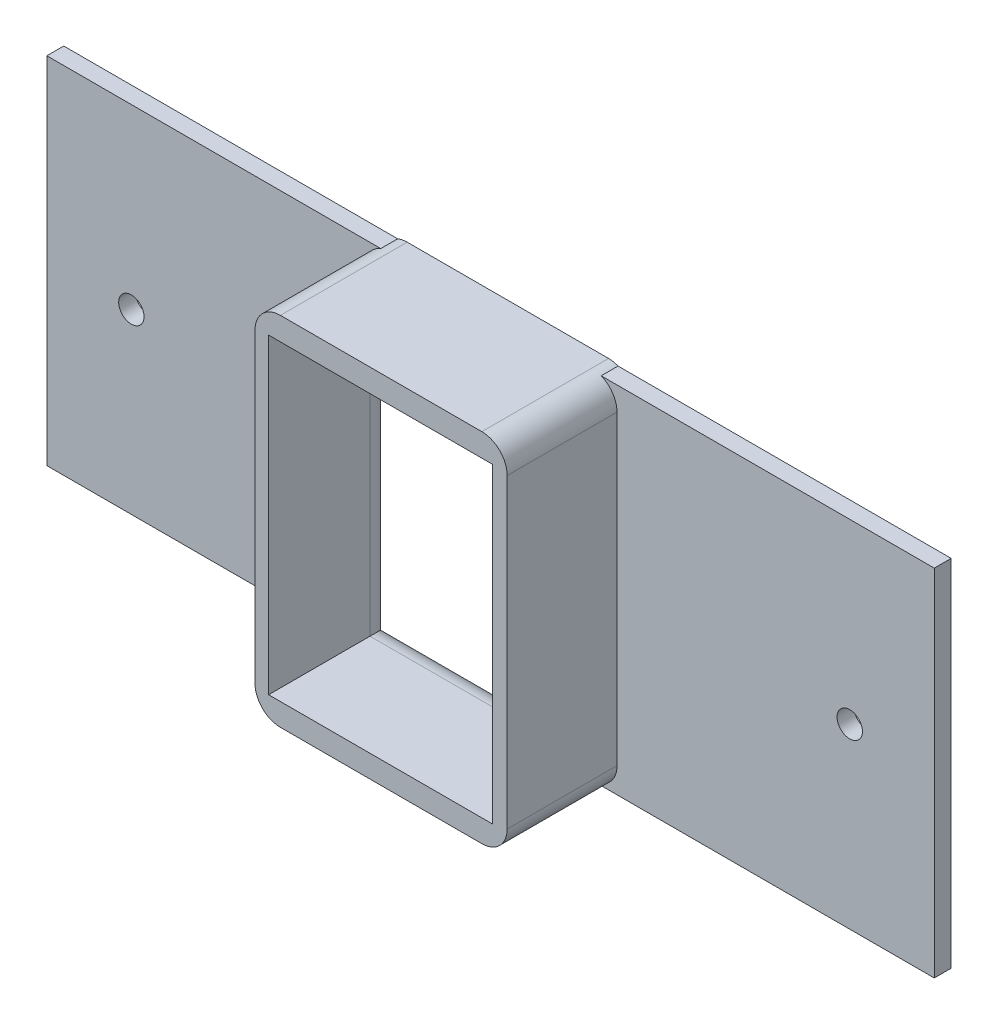
ISO-10303-21;
HEADER;
FILE_DESCRIPTION(('STEP AP214'),'2;1');
FILE_NAME('part.step','',(''),(''),'','','');
FILE_SCHEMA(('AUTOMOTIVE_DESIGN { 1 0 10303 214 1 1 1 1 }'));
ENDSEC;
DATA;
#1=APPLICATION_CONTEXT('core data for automotive mechanical design processes');
#2=APPLICATION_PROTOCOL_DEFINITION('international standard','automotive_design',2000,#1);
#3=PRODUCT_CONTEXT('',#1,'mechanical');
#4=PRODUCT('Part','Part','',(#3));
#5=PRODUCT_RELATED_PRODUCT_CATEGORY('part','',(#4));
#6=PRODUCT_DEFINITION_FORMATION('','',#4);
#7=PRODUCT_DEFINITION_CONTEXT('part definition',#1,'design');
#8=PRODUCT_DEFINITION('design','',#6,#7);
#9=PRODUCT_DEFINITION_SHAPE('','',#8);
#10=(LENGTH_UNIT() NAMED_UNIT(*) SI_UNIT(.MILLI.,.METRE.));
#11=(NAMED_UNIT(*) PLANE_ANGLE_UNIT() SI_UNIT($,.RADIAN.));
#12=(NAMED_UNIT(*) SI_UNIT($,.STERADIAN.) SOLID_ANGLE_UNIT());
#13=UNCERTAINTY_MEASURE_WITH_UNIT(LENGTH_MEASURE(1.E-05),#10,'distance_accuracy_value','');
#14=(GEOMETRIC_REPRESENTATION_CONTEXT(3) GLOBAL_UNCERTAINTY_ASSIGNED_CONTEXT((#13)) GLOBAL_UNIT_ASSIGNED_CONTEXT((#10,
#11,#12)) REPRESENTATION_CONTEXT('',''));
#15=CARTESIAN_POINT('',(0.,0.,0.));
#16=DIRECTION('',(0.,0.,1.));
#17=DIRECTION('',(1.,0.,0.));
#18=AXIS2_PLACEMENT_3D('',#15,#16,#17);
#19=CARTESIAN_POINT('',(0.,0.,0.));
#20=DIRECTION('',(0.,0.,1.));
#21=DIRECTION('',(1.,0.,0.));
#22=AXIS2_PLACEMENT_3D('',#19,#20,#21);
#23=PLANE('',#22);
#24=CARTESIAN_POINT('',(-47.1065459610028,9.56406685236769,0.));
#25=DIRECTION('',(0.,0.,1.));
#26=DIRECTION('',(1.,0.,0.));
#27=AXIS2_PLACEMENT_3D('',#24,#25,#26);
#28=CIRCLE('',#27,1.5);
#29=CARTESIAN_POINT('',(-45.6065459610028,9.56406685236769,0.));
#30=VERTEX_POINT('',#29);
#31=EDGE_CURVE('E765',#30,#30,#28,.T.);
#32=ORIENTED_EDGE('',*,*,#31,.T.);
#33=EDGE_LOOP('',(#32));
#34=FACE_BOUND('',#33,.T.);
#35=CARTESIAN_POINT('',(37.8934540389972,9.56406685236769,0.));
#36=DIRECTION('',(0.,0.,1.));
#37=DIRECTION('',(1.,0.,0.));
#38=AXIS2_PLACEMENT_3D('',#35,#36,#37);
#39=CIRCLE('',#38,1.5);
#40=CARTESIAN_POINT('',(39.3934540389972,9.56406685236769,0.));
#41=VERTEX_POINT('',#40);
#42=EDGE_CURVE('E220',#41,#41,#39,.T.);
#43=ORIENTED_EDGE('',*,*,#42,.T.);
#44=EDGE_LOOP('',(#43));
#45=FACE_BOUND('',#44,.T.);
#46=CARTESIAN_POINT('',(7.35968979504176,27.781824029674,0.));
#47=DIRECTION('',(0.,0.,1.));
#48=DIRECTION('',(1.,0.,0.));
#49=AXIS2_PLACEMENT_3D('',#46,#47,#48);
#50=CIRCLE('',#49,3.);
#51=CARTESIAN_POINT('',(7.35968979504176,30.781824029674,0.));
#52=VERTEX_POINT('',#51);
#53=CARTESIAN_POINT('',(8.48179713196166,30.5640668523677,0.));
#54=VERTEX_POINT('',#53);
#55=EDGE_CURVE('E359',#52,#54,#50,.F.);
#56=ORIENTED_EDGE('',*,*,#55,.T.);
#57=DIRECTION('',(-1.,0.,0.));
#58=VECTOR('',#57,1.);
#59=CARTESIAN_POINT('',(-57.1065459610028,30.5640668523677,0.));
#60=LINE('',#59,#58);
#61=CARTESIAN_POINT('',(47.8934540389972,30.5640668523677,0.));
#62=VERTEX_POINT('',#61);
#63=EDGE_CURVE('E271',#62,#54,#60,.T.);
#64=ORIENTED_EDGE('',*,*,#63,.F.);
#65=DIRECTION('',(0.,1.,0.));
#66=VECTOR('',#65,1.);
#67=CARTESIAN_POINT('',(47.8934540389972,30.5640668523677,0.));
#68=LINE('',#67,#66);
#69=CARTESIAN_POINT('',(47.8934540389972,-11.4359331476323,0.));
#70=VERTEX_POINT('',#69);
#71=EDGE_CURVE('E289',#70,#62,#68,.T.);
#72=ORIENTED_EDGE('',*,*,#71,.F.);
#73=DIRECTION('',(1.,0.,0.));
#74=VECTOR('',#73,1.);
#75=CARTESIAN_POINT('',(-57.1065459610028,-11.4359331476323,0.));
#76=LINE('',#75,#74);
#77=CARTESIAN_POINT('',(11.6512429148281,-11.4359331476323,0.));
#78=VERTEX_POINT('',#77);
#79=EDGE_CURVE('E284',#78,#70,#76,.T.);
#80=ORIENTED_EDGE('',*,*,#79,.F.);
#81=DIRECTION('',(0.,1.,0.));
#82=VECTOR('',#81,1.);
#83=CARTESIAN_POINT('',(11.6512429148281,0.,0.));
#84=LINE('',#83,#82);
#85=CARTESIAN_POINT('',(11.6512429148281,28.064066852369,0.));
#86=VERTEX_POINT('',#85);
#87=EDGE_CURVE('E320',#78,#86,#84,.T.);
#88=ORIENTED_EDGE('',*,*,#87,.T.);
#89=DIRECTION('',(-1.,0.,0.));
#90=VECTOR('',#89,1.);
#91=CARTESIAN_POINT('',(8.65124291482812,28.064066852369,0.));
#92=LINE('',#91,#90);
#93=CARTESIAN_POINT('',(-20.8643348368333,28.064066852369,0.));
#94=VERTEX_POINT('',#93);
#95=EDGE_CURVE('E217',#86,#94,#92,.T.);
#96=ORIENTED_EDGE('',*,*,#95,.T.);
#97=DIRECTION('',(0.,1.,0.));
#98=VECTOR('',#97,1.);
#99=CARTESIAN_POINT('',(-20.8643348368333,0.,0.));
#100=LINE('',#99,#98);
#101=CARTESIAN_POINT('',(-20.8643348368333,-11.4359331476323,0.));
#102=VERTEX_POINT('',#101);
#103=EDGE_CURVE('E317',#94,#102,#100,.F.);
#104=ORIENTED_EDGE('',*,*,#103,.T.);
#105=CARTESIAN_POINT('',(-57.1065459610028,-11.4359331476323,0.));
#106=VERTEX_POINT('',#105);
#107=EDGE_CURVE('E285',#106,#102,#76,.T.);
#108=ORIENTED_EDGE('',*,*,#107,.F.);
#109=DIRECTION('',(0.,-1.,0.));
#110=VECTOR('',#109,1.);
#111=CARTESIAN_POINT('',(-57.1065459610028,30.5640668523677,0.));
#112=LINE('',#111,#110);
#113=CARTESIAN_POINT('',(-57.1065459610028,30.5640668523677,0.));
#114=VERTEX_POINT('',#113);
#115=EDGE_CURVE('E265',#114,#106,#112,.T.);
#116=ORIENTED_EDGE('',*,*,#115,.F.);
#117=CARTESIAN_POINT('',(-17.5964586609376,30.5640668523677,0.));
#118=VERTEX_POINT('',#117);
#119=EDGE_CURVE('E292',#118,#114,#60,.T.);
#120=ORIENTED_EDGE('',*,*,#119,.F.);
#121=CARTESIAN_POINT('',(-16.4743513240176,27.781824029674,0.));
#122=DIRECTION('',(0.,0.,1.));
#123=DIRECTION('',(1.,0.,0.));
#124=AXIS2_PLACEMENT_3D('',#121,#122,#123);
#125=CIRCLE('',#124,3.);
#126=CARTESIAN_POINT('',(-16.4743513240176,30.781824029674,0.));
#127=VERTEX_POINT('',#126);
#128=EDGE_CURVE('E356',#118,#127,#125,.F.);
#129=ORIENTED_EDGE('',*,*,#128,.T.);
#130=DIRECTION('',(1.,0.,0.));
#131=VECTOR('',#130,1.);
#132=CARTESIAN_POINT('',(10.3596897950418,30.781824029674,0.));
#133=LINE('',#132,#131);
#134=EDGE_CURVE('E231',#127,#52,#133,.T.);
#135=ORIENTED_EDGE('',*,*,#134,.T.);
#136=EDGE_LOOP('',(#56,#64,#72,#80,#88,#96,#104,#108,#116,#120,#129,#135));
#137=FACE_BOUND('',#136,.T.);
#138=ADVANCED_FACE('F43',(#34,#45,#137),#23,.F.);
#139=CARTESIAN_POINT('',(-57.1065459610028,30.5640668523677,2.));
#140=DIRECTION('',(0.,-1.,0.));
#141=DIRECTION('',(0.,0.,-1.));
#142=AXIS2_PLACEMENT_3D('',#139,#140,#141);
#143=PLANE('',#142);
#144=ORIENTED_EDGE('',*,*,#63,.T.);
#145=DIRECTION('',(0.,0.,-1.));
#146=VECTOR('',#145,1.);
#147=CARTESIAN_POINT('',(8.48179713196166,30.5640668523677,0.));
#148=LINE('',#147,#146);
#149=CARTESIAN_POINT('',(8.48179713196167,30.5640668523677,2.));
#150=VERTEX_POINT('',#149);
#151=EDGE_CURVE('E396',#54,#150,#148,.F.);
#152=ORIENTED_EDGE('',*,*,#151,.T.);
#153=DIRECTION('',(-1.,0.,0.));
#154=VECTOR('',#153,1.);
#155=CARTESIAN_POINT('',(-57.1065459610028,30.5640668523677,2.));
#156=LINE('',#155,#154);
#157=CARTESIAN_POINT('',(47.8934540389972,30.5640668523677,2.));
#158=VERTEX_POINT('',#157);
#159=EDGE_CURVE('E67',#158,#150,#156,.T.);
#160=ORIENTED_EDGE('',*,*,#159,.F.);
#161=DIRECTION('',(0.,0.,-1.));
#162=VECTOR('',#161,1.);
#163=CARTESIAN_POINT('',(47.8934540389972,30.5640668523677,2.));
#164=LINE('',#163,#162);
#165=EDGE_CURVE('E298',#158,#62,#164,.T.);
#166=ORIENTED_EDGE('',*,*,#165,.T.);
#167=EDGE_LOOP('',(#144,#152,#160,#166));
#168=FACE_BOUND('',#167,.T.);
#169=ADVANCED_FACE('F433',(#168),#143,.F.);
#170=CARTESIAN_POINT('',(0.,0.,2.));
#171=DIRECTION('',(0.,0.,1.));
#172=DIRECTION('',(1.,0.,0.));
#173=AXIS2_PLACEMENT_3D('',#170,#171,#172);
#174=PLANE('',#173);
#175=CARTESIAN_POINT('',(37.8934540389972,9.56406685236769,2.));
#176=DIRECTION('',(0.,0.,1.));
#177=DIRECTION('',(1.,0.,0.));
#178=AXIS2_PLACEMENT_3D('',#175,#176,#177);
#179=CIRCLE('',#178,1.5);
#180=CARTESIAN_POINT('',(39.3934540389972,9.56406685236769,2.));
#181=VERTEX_POINT('',#180);
#182=EDGE_CURVE('E761',#181,#181,#179,.T.);
#183=ORIENTED_EDGE('',*,*,#182,.F.);
#184=EDGE_LOOP('',(#183));
#185=FACE_BOUND('',#184,.T.);
#186=DIRECTION('',(0.,1.,0.));
#187=VECTOR('',#186,1.);
#188=CARTESIAN_POINT('',(10.3596897950418,0.,2.));
#189=LINE('',#188,#187);
#190=CARTESIAN_POINT('',(10.3596897950418,-8.43593314763232,2.));
#191=VERTEX_POINT('',#190);
#192=CARTESIAN_POINT('',(10.3596897950418,27.781824029674,2.));
#193=VERTEX_POINT('',#192);
#194=EDGE_CURVE('E261',#191,#193,#189,.T.);
#195=ORIENTED_EDGE('',*,*,#194,.F.);
#196=CARTESIAN_POINT('',(7.35968979504176,-8.43593314763232,2.));
#197=DIRECTION('',(0.,0.,1.));
#198=DIRECTION('',(1.,0.,0.));
#199=AXIS2_PLACEMENT_3D('',#196,#197,#198);
#200=CIRCLE('',#199,3.);
#201=CARTESIAN_POINT('',(7.35968979504176,-11.4359331476323,2.));
#202=VERTEX_POINT('',#201);
#203=EDGE_CURVE('E402',#191,#202,#200,.F.);
#204=ORIENTED_EDGE('',*,*,#203,.T.);
#205=DIRECTION('',(1.,0.,0.));
#206=VECTOR('',#205,1.);
#207=CARTESIAN_POINT('',(-57.1065459610028,-11.4359331476323,2.));
#208=LINE('',#207,#206);
#209=CARTESIAN_POINT('',(47.8934540389972,-11.4359331476323,2.));
#210=VERTEX_POINT('',#209);
#211=EDGE_CURVE('E270',#202,#210,#208,.T.);
#212=ORIENTED_EDGE('',*,*,#211,.T.);
#213=DIRECTION('',(0.,1.,0.));
#214=VECTOR('',#213,1.);
#215=CARTESIAN_POINT('',(47.8934540389972,30.5640668523677,2.));
#216=LINE('',#215,#214);
#217=EDGE_CURVE('E275',#210,#158,#216,.T.);
#218=ORIENTED_EDGE('',*,*,#217,.T.);
#219=ORIENTED_EDGE('',*,*,#159,.T.);
#220=CARTESIAN_POINT('',(7.35968979504176,27.781824029674,2.));
#221=DIRECTION('',(0.,0.,1.));
#222=DIRECTION('',(1.,0.,0.));
#223=AXIS2_PLACEMENT_3D('',#220,#221,#222);
#224=CIRCLE('',#223,3.);
#225=EDGE_CURVE('E399',#150,#193,#224,.F.);
#226=ORIENTED_EDGE('',*,*,#225,.T.);
#227=EDGE_LOOP('',(#195,#204,#212,#218,#219,#226));
#228=FACE_BOUND('',#227,.T.);
#229=ADVANCED_FACE('F474',(#185,#228),#174,.T.);
#230=CARTESIAN_POINT('',(-57.1065459610028,30.5640668523677,2.));
#231=DIRECTION('',(1.,0.,0.));
#232=DIRECTION('',(0.,0.,-1.));
#233=AXIS2_PLACEMENT_3D('',#230,#231,#232);
#234=PLANE('',#233);
#235=ORIENTED_EDGE('',*,*,#115,.T.);
#236=DIRECTION('',(0.,0.,-1.));
#237=VECTOR('',#236,1.);
#238=CARTESIAN_POINT('',(-57.1065459610028,-11.4359331476323,2.));
#239=LINE('',#238,#237);
#240=CARTESIAN_POINT('',(-57.1065459610028,-11.4359331476323,2.));
#241=VERTEX_POINT('',#240);
#242=EDGE_CURVE('E306',#241,#106,#239,.T.);
#243=ORIENTED_EDGE('',*,*,#242,.F.);
#244=DIRECTION('',(0.,-1.,0.));
#245=VECTOR('',#244,1.);
#246=CARTESIAN_POINT('',(-57.1065459610028,30.5640668523677,2.));
#247=LINE('',#246,#245);
#248=CARTESIAN_POINT('',(-57.1065459610028,30.5640668523677,2.));
#249=VERTEX_POINT('',#248);
#250=EDGE_CURVE('E266',#249,#241,#247,.T.);
#251=ORIENTED_EDGE('',*,*,#250,.F.);
#252=DIRECTION('',(0.,0.,-1.));
#253=VECTOR('',#252,1.);
#254=CARTESIAN_POINT('',(-57.1065459610028,30.5640668523677,2.));
#255=LINE('',#254,#253);
#256=EDGE_CURVE('E280',#249,#114,#255,.T.);
#257=ORIENTED_EDGE('',*,*,#256,.T.);
#258=EDGE_LOOP('',(#235,#243,#251,#257));
#259=FACE_BOUND('',#258,.T.);
#260=ADVANCED_FACE('F453',(#259),#234,.F.);
#261=CARTESIAN_POINT('',(-57.1065459610028,-11.4359331476323,2.));
#262=DIRECTION('',(0.,1.,0.));
#263=DIRECTION('',(0.,0.,1.));
#264=AXIS2_PLACEMENT_3D('',#261,#262,#263);
#265=PLANE('',#264);
#266=ORIENTED_EDGE('',*,*,#211,.F.);
#267=DIRECTION('',(0.,0.,-1.));
#268=VECTOR('',#267,1.);
#269=CARTESIAN_POINT('',(7.35968979504176,-11.4359331476323,15.));
#270=LINE('',#269,#268);
#271=CARTESIAN_POINT('',(7.35968979504176,-11.4359331476323,15.));
#272=VERTEX_POINT('',#271);
#273=EDGE_CURVE('E386',#202,#272,#270,.F.);
#274=ORIENTED_EDGE('',*,*,#273,.T.);
#275=DIRECTION('',(-1.,0.,0.));
#276=VECTOR('',#275,1.);
#277=CARTESIAN_POINT('',(10.3596897950418,-11.4359331476323,15.));
#278=LINE('',#277,#276);
#279=CARTESIAN_POINT('',(-16.4743513240176,-11.4359331476323,15.));
#280=VERTEX_POINT('',#279);
#281=EDGE_CURVE('E242',#272,#280,#278,.T.);
#282=ORIENTED_EDGE('',*,*,#281,.T.);
#283=DIRECTION('',(0.,0.,-1.));
#284=VECTOR('',#283,1.);
#285=CARTESIAN_POINT('',(-16.4743513240177,-11.4359331476323,2.));
#286=LINE('',#285,#284);
#287=CARTESIAN_POINT('',(-16.4743513240177,-11.4359331476323,2.));
#288=VERTEX_POINT('',#287);
#289=EDGE_CURVE('E382',#280,#288,#286,.T.);
#290=ORIENTED_EDGE('',*,*,#289,.T.);
#291=EDGE_CURVE('E272',#241,#288,#208,.T.);
#292=ORIENTED_EDGE('',*,*,#291,.F.);
#293=ORIENTED_EDGE('',*,*,#242,.T.);
#294=ORIENTED_EDGE('',*,*,#107,.T.);
#295=CARTESIAN_POINT('',(-20.8643348368333,-11.4359331476323,3.));
#296=DIRECTION('',(0.,1.,0.));
#297=DIRECTION('',(0.,0.,1.));
#298=AXIS2_PLACEMENT_3D('',#295,#296,#297);
#299=CIRCLE('',#298,3.);
#300=CARTESIAN_POINT('',(-20.5108835067505,-11.4359331476323,0.0208940674654282));
#301=VERTEX_POINT('',#300);
#302=EDGE_CURVE('E327',#102,#301,#299,.F.);
#303=ORIENTED_EDGE('',*,*,#302,.T.);
#304=DIRECTION('',(-1.,0.,0.));
#305=VECTOR('',#304,1.);
#306=CARTESIAN_POINT('',(-4.6065459610026,-11.4359331476323,0.0208940674654287));
#307=LINE('',#306,#305);
#308=CARTESIAN_POINT('',(11.2977915847453,-11.4359331476323,0.0208940674654282));
#309=VERTEX_POINT('',#308);
#310=EDGE_CURVE('E314',#301,#309,#307,.F.);
#311=ORIENTED_EDGE('',*,*,#310,.T.);
#312=CARTESIAN_POINT('',(11.6512429148281,-11.4359331476323,3.));
#313=DIRECTION('',(0.,1.,0.));
#314=DIRECTION('',(0.,0.,1.));
#315=AXIS2_PLACEMENT_3D('',#312,#313,#314);
#316=CIRCLE('',#315,3.);
#317=EDGE_CURVE('E331',#309,#78,#316,.F.);
#318=ORIENTED_EDGE('',*,*,#317,.T.);
#319=ORIENTED_EDGE('',*,*,#79,.T.);
#320=DIRECTION('',(0.,0.,-1.));
#321=VECTOR('',#320,1.);
#322=CARTESIAN_POINT('',(47.8934540389972,-11.4359331476323,2.));
#323=LINE('',#322,#321);
#324=EDGE_CURVE('E302',#210,#70,#323,.T.);
#325=ORIENTED_EDGE('',*,*,#324,.F.);
#326=EDGE_LOOP('',(#266,#274,#282,#290,#292,#293,#294,#303,#311,#318,#319,#325));
#327=FACE_BOUND('',#326,.T.);
#328=ADVANCED_FACE('F440',(#327),#265,.F.);
#329=CARTESIAN_POINT('',(47.8934540389972,30.5640668523677,2.));
#330=DIRECTION('',(-1.,0.,0.));
#331=DIRECTION('',(0.,-1.,0.));
#332=AXIS2_PLACEMENT_3D('',#329,#330,#331);
#333=PLANE('',#332);
#334=ORIENTED_EDGE('',*,*,#71,.T.);
#335=ORIENTED_EDGE('',*,*,#165,.F.);
#336=ORIENTED_EDGE('',*,*,#217,.F.);
#337=ORIENTED_EDGE('',*,*,#324,.T.);
#338=EDGE_LOOP('',(#334,#335,#336,#337));
#339=FACE_BOUND('',#338,.T.);
#340=ADVANCED_FACE('F437',(#339),#333,.F.);
#341=CARTESIAN_POINT('',(-17.5964586609376,30.5640668523677,2.));
#342=VERTEX_POINT('',#341);
#343=EDGE_CURVE('E59',#342,#249,#156,.T.);
#344=ORIENTED_EDGE('',*,*,#343,.F.);
#345=DIRECTION('',(0.,0.,-1.));
#346=VECTOR('',#345,1.);
#347=CARTESIAN_POINT('',(-17.5964586609376,30.5640668523677,2.));
#348=LINE('',#347,#346);
#349=EDGE_CURVE('E52',#342,#118,#348,.T.);
#350=ORIENTED_EDGE('',*,*,#349,.T.);
#351=ORIENTED_EDGE('',*,*,#119,.T.);
#352=ORIENTED_EDGE('',*,*,#256,.F.);
#353=EDGE_LOOP('',(#344,#350,#351,#352));
#354=FACE_BOUND('',#353,.T.);
#355=ADVANCED_FACE('F411',(#354),#143,.F.);
#356=CARTESIAN_POINT('',(-47.1065459610028,9.56406685236769,2.));
#357=DIRECTION('',(0.,0.,1.));
#358=DIRECTION('',(1.,0.,0.));
#359=AXIS2_PLACEMENT_3D('',#356,#357,#358);
#360=CIRCLE('',#359,1.5);
#361=CARTESIAN_POINT('',(-45.6065459610028,9.56406685236769,2.));
#362=VERTEX_POINT('',#361);
#363=EDGE_CURVE('E767',#362,#362,#360,.T.);
#364=ORIENTED_EDGE('',*,*,#363,.F.);
#365=EDGE_LOOP('',(#364));
#366=FACE_BOUND('',#365,.T.);
#367=DIRECTION('',(0.,-1.,0.));
#368=VECTOR('',#367,1.);
#369=CARTESIAN_POINT('',(-19.4743513240176,0.,2.));
#370=LINE('',#369,#368);
#371=CARTESIAN_POINT('',(-19.4743513240176,27.781824029674,2.));
#372=VERTEX_POINT('',#371);
#373=CARTESIAN_POINT('',(-19.4743513240176,-8.43593314763232,2.));
#374=VERTEX_POINT('',#373);
#375=EDGE_CURVE('E254',#372,#374,#370,.T.);
#376=ORIENTED_EDGE('',*,*,#375,.F.);
#377=CARTESIAN_POINT('',(-16.4743513240176,27.781824029674,2.));
#378=DIRECTION('',(0.,0.,1.));
#379=DIRECTION('',(1.,0.,0.));
#380=AXIS2_PLACEMENT_3D('',#377,#378,#379);
#381=CIRCLE('',#380,3.);
#382=EDGE_CURVE('E406',#372,#342,#381,.F.);
#383=ORIENTED_EDGE('',*,*,#382,.T.);
#384=ORIENTED_EDGE('',*,*,#343,.T.);
#385=ORIENTED_EDGE('',*,*,#250,.T.);
#386=ORIENTED_EDGE('',*,*,#291,.T.);
#387=CARTESIAN_POINT('',(-16.4743513240177,-8.43593314763232,2.));
#388=DIRECTION('',(0.,0.,1.));
#389=DIRECTION('',(1.,0.,0.));
#390=AXIS2_PLACEMENT_3D('',#387,#388,#389);
#391=CIRCLE('',#390,3.);
#392=EDGE_CURVE('E11',#288,#374,#391,.F.);
#393=ORIENTED_EDGE('',*,*,#392,.T.);
#394=EDGE_LOOP('',(#376,#383,#384,#385,#386,#393));
#395=FACE_BOUND('',#394,.T.);
#396=ADVANCED_FACE('F449',(#366,#395),#174,.T.);
#397=CARTESIAN_POINT('',(10.3596897950418,30.781824029674,15.));
#398=DIRECTION('',(1.,0.,0.));
#399=DIRECTION('',(0.,0.,-1.));
#400=AXIS2_PLACEMENT_3D('',#397,#398,#399);
#401=PLANE('',#400);
#402=ORIENTED_EDGE('',*,*,#194,.T.);
#403=DIRECTION('',(0.,0.,-1.));
#404=VECTOR('',#403,1.);
#405=CARTESIAN_POINT('',(10.3596897950418,27.781824029674,15.));
#406=LINE('',#405,#404);
#407=CARTESIAN_POINT('',(10.3596897950418,27.781824029674,15.));
#408=VERTEX_POINT('',#407);
#409=EDGE_CURVE('E367',#193,#408,#406,.F.);
#410=ORIENTED_EDGE('',*,*,#409,.T.);
#411=DIRECTION('',(0.,-1.,0.));
#412=VECTOR('',#411,1.);
#413=CARTESIAN_POINT('',(10.3596897950418,30.781824029674,15.));
#414=LINE('',#413,#412);
#415=CARTESIAN_POINT('',(10.3596897950418,-8.4359331476323,15.));
#416=VERTEX_POINT('',#415);
#417=EDGE_CURVE('E238',#408,#416,#414,.T.);
#418=ORIENTED_EDGE('',*,*,#417,.T.);
#419=DIRECTION('',(0.,0.,-1.));
#420=VECTOR('',#419,1.);
#421=CARTESIAN_POINT('',(10.3596897950418,-8.43593314763232,2.));
#422=LINE('',#421,#420);
#423=EDGE_CURVE('E363',#416,#191,#422,.T.);
#424=ORIENTED_EDGE('',*,*,#423,.T.);
#425=EDGE_LOOP('',(#402,#410,#418,#424));
#426=FACE_BOUND('',#425,.T.);
#427=ADVANCED_FACE('F469',(#426),#401,.T.);
#428=CARTESIAN_POINT('',(-19.4743513240176,30.781824029674,15.));
#429=DIRECTION('',(-1.,0.,0.));
#430=DIRECTION('',(0.,0.,1.));
#431=AXIS2_PLACEMENT_3D('',#428,#429,#430);
#432=PLANE('',#431);
#433=DIRECTION('',(0.,1.,0.));
#434=VECTOR('',#433,1.);
#435=CARTESIAN_POINT('',(-19.4743513240176,30.781824029674,15.));
#436=LINE('',#435,#434);
#437=CARTESIAN_POINT('',(-19.4743513240176,-8.4359331476323,15.));
#438=VERTEX_POINT('',#437);
#439=CARTESIAN_POINT('',(-19.4743513240176,27.781824029674,15.));
#440=VERTEX_POINT('',#439);
#441=EDGE_CURVE('E246',#438,#440,#436,.T.);
#442=ORIENTED_EDGE('',*,*,#441,.T.);
#443=DIRECTION('',(0.,0.,-1.));
#444=VECTOR('',#443,1.);
#445=CARTESIAN_POINT('',(-19.4743513240176,27.781824029674,15.));
#446=LINE('',#445,#444);
#447=EDGE_CURVE('E392',#440,#372,#446,.T.);
#448=ORIENTED_EDGE('',*,*,#447,.T.);
#449=ORIENTED_EDGE('',*,*,#375,.T.);
#450=DIRECTION('',(0.,0.,-1.));
#451=VECTOR('',#450,1.);
#452=CARTESIAN_POINT('',(-19.4743513240176,-8.43593314763232,15.));
#453=LINE('',#452,#451);
#454=EDGE_CURVE('E389',#374,#438,#453,.F.);
#455=ORIENTED_EDGE('',*,*,#454,.T.);
#456=EDGE_LOOP('',(#442,#448,#449,#455));
#457=FACE_BOUND('',#456,.T.);
#458=ADVANCED_FACE('F462',(#457),#432,.T.);
#459=CARTESIAN_POINT('',(10.3596897950418,30.781824029674,15.));
#460=DIRECTION('',(0.,1.,0.));
#461=DIRECTION('',(0.,0.,1.));
#462=AXIS2_PLACEMENT_3D('',#459,#460,#461);
#463=PLANE('',#462);
#464=DIRECTION('',(1.,0.,0.));
#465=VECTOR('',#464,1.);
#466=CARTESIAN_POINT('',(10.3596897950418,30.781824029674,15.));
#467=LINE('',#466,#465);
#468=CARTESIAN_POINT('',(-16.4743513240176,30.781824029674,15.));
#469=VERTEX_POINT('',#468);
#470=CARTESIAN_POINT('',(7.35968979504176,30.781824029674,15.));
#471=VERTEX_POINT('',#470);
#472=EDGE_CURVE('E250',#469,#471,#467,.T.);
#473=ORIENTED_EDGE('',*,*,#472,.T.);
#474=DIRECTION('',(0.,0.,-1.));
#475=VECTOR('',#474,1.);
#476=CARTESIAN_POINT('',(7.35968979504176,30.781824029674,15.));
#477=LINE('',#476,#475);
#478=EDGE_CURVE('E352',#471,#52,#477,.T.);
#479=ORIENTED_EDGE('',*,*,#478,.T.);
#480=ORIENTED_EDGE('',*,*,#134,.F.);
#481=DIRECTION('',(0.,0.,-1.));
#482=VECTOR('',#481,1.);
#483=CARTESIAN_POINT('',(-16.4743513240176,30.781824029674,15.));
#484=LINE('',#483,#482);
#485=EDGE_CURVE('E349',#127,#469,#484,.F.);
#486=ORIENTED_EDGE('',*,*,#485,.T.);
#487=EDGE_LOOP('',(#473,#479,#480,#486));
#488=FACE_BOUND('',#487,.T.);
#489=ADVANCED_FACE('F420',(#488),#463,.T.);
#490=CARTESIAN_POINT('',(0.,0.,15.));
#491=DIRECTION('',(0.,0.,-1.));
#492=DIRECTION('',(-1.,0.,0.));
#493=AXIS2_PLACEMENT_3D('',#490,#491,#492);
#494=PLANE('',#493);
#495=DIRECTION('',(-1.,0.,0.));
#496=VECTOR('',#495,1.);
#497=CARTESIAN_POINT('',(8.65124291482812,-8.78938447771516,15.));
#498=LINE('',#497,#496);
#499=CARTESIAN_POINT('',(8.65124291482812,-8.78938447771516,15.));
#500=VERTEX_POINT('',#499);
#501=CARTESIAN_POINT('',(-17.8643348368333,-8.78938447771516,15.));
#502=VERTEX_POINT('',#501);
#503=EDGE_CURVE('E201',#500,#502,#498,.T.);
#504=ORIENTED_EDGE('',*,*,#503,.T.);
#505=DIRECTION('',(0.,1.,0.));
#506=VECTOR('',#505,1.);
#507=CARTESIAN_POINT('',(-17.8643348368333,-8.78938447771516,15.));
#508=LINE('',#507,#506);
#509=CARTESIAN_POINT('',(-17.8643348368333,28.064066852369,15.));
#510=VERTEX_POINT('',#509);
#511=EDGE_CURVE('E193',#502,#510,#508,.T.);
#512=ORIENTED_EDGE('',*,*,#511,.T.);
#513=DIRECTION('',(1.,0.,0.));
#514=VECTOR('',#513,1.);
#515=CARTESIAN_POINT('',(8.65124291482812,28.064066852369,15.));
#516=LINE('',#515,#514);
#517=CARTESIAN_POINT('',(8.65124291482812,28.064066852369,15.));
#518=VERTEX_POINT('',#517);
#519=EDGE_CURVE('E205',#510,#518,#516,.T.);
#520=ORIENTED_EDGE('',*,*,#519,.T.);
#521=DIRECTION('',(0.,-1.,0.));
#522=VECTOR('',#521,1.);
#523=CARTESIAN_POINT('',(8.65124291482812,-8.78938447771516,15.));
#524=LINE('',#523,#522);
#525=EDGE_CURVE('E211',#518,#500,#524,.T.);
#526=ORIENTED_EDGE('',*,*,#525,.T.);
#527=EDGE_LOOP('',(#504,#512,#520,#526));
#528=FACE_BOUND('',#527,.T.);
#529=ORIENTED_EDGE('',*,*,#417,.F.);
#530=CARTESIAN_POINT('',(7.35968979504176,27.781824029674,15.));
#531=DIRECTION('',(0.,0.,-1.));
#532=DIRECTION('',(-1.,0.,0.));
#533=AXIS2_PLACEMENT_3D('',#530,#531,#532);
#534=CIRCLE('',#533,3.);
#535=EDGE_CURVE('E379',#408,#471,#534,.F.);
#536=ORIENTED_EDGE('',*,*,#535,.T.);
#537=ORIENTED_EDGE('',*,*,#472,.F.);
#538=CARTESIAN_POINT('',(-16.4743513240176,27.781824029674,15.));
#539=DIRECTION('',(0.,0.,-1.));
#540=DIRECTION('',(-1.,0.,0.));
#541=AXIS2_PLACEMENT_3D('',#538,#539,#540);
#542=CIRCLE('',#541,3.);
#543=EDGE_CURVE('E373',#469,#440,#542,.F.);
#544=ORIENTED_EDGE('',*,*,#543,.T.);
#545=ORIENTED_EDGE('',*,*,#441,.F.);
#546=CARTESIAN_POINT('',(-16.4743513240177,-8.43593314763232,15.));
#547=DIRECTION('',(0.,0.,-1.));
#548=DIRECTION('',(-1.,0.,0.));
#549=AXIS2_PLACEMENT_3D('',#546,#547,#548);
#550=CIRCLE('',#549,3.);
#551=EDGE_CURVE('E370',#438,#280,#550,.F.);
#552=ORIENTED_EDGE('',*,*,#551,.T.);
#553=ORIENTED_EDGE('',*,*,#281,.F.);
#554=CARTESIAN_POINT('',(7.35968979504176,-8.43593314763232,15.));
#555=DIRECTION('',(0.,0.,-1.));
#556=DIRECTION('',(-1.,0.,0.));
#557=AXIS2_PLACEMENT_3D('',#554,#555,#556);
#558=CIRCLE('',#557,3.);
#559=EDGE_CURVE('E376',#272,#416,#558,.F.);
#560=ORIENTED_EDGE('',*,*,#559,.T.);
#561=EDGE_LOOP('',(#529,#536,#537,#544,#545,#552,#553,#560));
#562=FACE_BOUND('',#561,.T.);
#563=ADVANCED_FACE('F213',(#528,#562),#494,.F.);
#564=CARTESIAN_POINT('',(-17.8643348368333,-8.78938447771516,15.));
#565=DIRECTION('',(-1.,0.,0.));
#566=DIRECTION('',(0.,0.,1.));
#567=AXIS2_PLACEMENT_3D('',#564,#565,#566);
#568=PLANE('',#567);
#569=DIRECTION('',(0.,0.,-1.));
#570=VECTOR('',#569,1.);
#571=CARTESIAN_POINT('',(-17.8643348368333,-8.78938447771516,15.));
#572=LINE('',#571,#570);
#573=CARTESIAN_POINT('',(-17.8643348368333,-8.78938447771516,3.));
#574=VERTEX_POINT('',#573);
#575=EDGE_CURVE('E228',#502,#574,#572,.T.);
#576=ORIENTED_EDGE('',*,*,#575,.T.);
#577=DIRECTION('',(0.,1.,0.));
#578=VECTOR('',#577,1.);
#579=CARTESIAN_POINT('',(-17.8643348368333,-8.78938447771516,3.));
#580=LINE('',#579,#578);
#581=CARTESIAN_POINT('',(-17.8643348368333,28.064066852369,3.));
#582=VERTEX_POINT('',#581);
#583=EDGE_CURVE('E196',#574,#582,#580,.T.);
#584=ORIENTED_EDGE('',*,*,#583,.T.);
#585=DIRECTION('',(0.,0.,-1.));
#586=VECTOR('',#585,1.);
#587=CARTESIAN_POINT('',(-17.8643348368333,28.064066852369,15.));
#588=LINE('',#587,#586);
#589=EDGE_CURVE('E188',#510,#582,#588,.T.);
#590=ORIENTED_EDGE('',*,*,#589,.F.);
#591=ORIENTED_EDGE('',*,*,#511,.F.);
#592=EDGE_LOOP('',(#576,#584,#590,#591));
#593=FACE_BOUND('',#592,.T.);
#594=ADVANCED_FACE('F191',(#593),#568,.F.);
#595=CARTESIAN_POINT('',(8.65124291482812,-8.78938447771516,15.));
#596=DIRECTION('',(0.,-1.,0.));
#597=DIRECTION('',(0.,0.,-1.));
#598=AXIS2_PLACEMENT_3D('',#595,#596,#597);
#599=PLANE('',#598);
#600=DIRECTION('',(0.,0.,-1.));
#601=VECTOR('',#600,1.);
#602=CARTESIAN_POINT('',(8.65124291482812,-8.78938447771516,15.));
#603=LINE('',#602,#601);
#604=CARTESIAN_POINT('',(8.65124291482812,-8.78938447771516,3.));
#605=VERTEX_POINT('',#604);
#606=EDGE_CURVE('E232',#500,#605,#603,.T.);
#607=ORIENTED_EDGE('',*,*,#606,.T.);
#608=DIRECTION('',(-1.,0.,0.));
#609=VECTOR('',#608,1.);
#610=CARTESIAN_POINT('',(8.65124291482812,-8.78938447771516,3.));
#611=LINE('',#610,#609);
#612=EDGE_CURVE('E310',#605,#574,#611,.T.);
#613=ORIENTED_EDGE('',*,*,#612,.T.);
#614=ORIENTED_EDGE('',*,*,#575,.F.);
#615=ORIENTED_EDGE('',*,*,#503,.F.);
#616=EDGE_LOOP('',(#607,#613,#614,#615));
#617=FACE_BOUND('',#616,.T.);
#618=ADVANCED_FACE('F663',(#617),#599,.F.);
#619=CARTESIAN_POINT('',(8.65124291482812,-8.78938447771516,15.));
#620=DIRECTION('',(1.,0.,0.));
#621=DIRECTION('',(0.,0.,-1.));
#622=AXIS2_PLACEMENT_3D('',#619,#620,#621);
#623=PLANE('',#622);
#624=DIRECTION('',(0.,0.,-1.));
#625=VECTOR('',#624,1.);
#626=CARTESIAN_POINT('',(8.65124291482812,28.064066852369,15.));
#627=LINE('',#626,#625);
#628=CARTESIAN_POINT('',(8.65124291482812,28.064066852369,3.));
#629=VERTEX_POINT('',#628);
#630=EDGE_CURVE('E200',#518,#629,#627,.T.);
#631=ORIENTED_EDGE('',*,*,#630,.T.);
#632=DIRECTION('',(0.,1.,0.));
#633=VECTOR('',#632,1.);
#634=CARTESIAN_POINT('',(8.65124291482812,-8.78938447771516,3.));
#635=LINE('',#634,#633);
#636=EDGE_CURVE('E324',#629,#605,#635,.F.);
#637=ORIENTED_EDGE('',*,*,#636,.T.);
#638=ORIENTED_EDGE('',*,*,#606,.F.);
#639=ORIENTED_EDGE('',*,*,#525,.F.);
#640=EDGE_LOOP('',(#631,#637,#638,#639));
#641=FACE_BOUND('',#640,.T.);
#642=ADVANCED_FACE('F673',(#641),#623,.F.);
#643=CARTESIAN_POINT('',(8.65124291482812,28.064066852369,15.));
#644=DIRECTION('',(0.,1.,0.));
#645=DIRECTION('',(0.,0.,1.));
#646=AXIS2_PLACEMENT_3D('',#643,#644,#645);
#647=PLANE('',#646);
#648=ORIENTED_EDGE('',*,*,#589,.T.);
#649=CARTESIAN_POINT('',(-20.8643348368333,28.064066852369,3.));
#650=DIRECTION('',(0.,1.,0.));
#651=DIRECTION('',(0.,0.,1.));
#652=AXIS2_PLACEMENT_3D('',#649,#650,#651);
#653=CIRCLE('',#652,3.);
#654=EDGE_CURVE('E343',#582,#94,#653,.T.);
#655=ORIENTED_EDGE('',*,*,#654,.T.);
#656=ORIENTED_EDGE('',*,*,#95,.F.);
#657=CARTESIAN_POINT('',(11.6512429148281,28.064066852369,3.));
#658=DIRECTION('',(0.,1.,0.));
#659=DIRECTION('',(0.,0.,1.));
#660=AXIS2_PLACEMENT_3D('',#657,#658,#659);
#661=CIRCLE('',#660,3.);
#662=EDGE_CURVE('E336',#86,#629,#661,.T.);
#663=ORIENTED_EDGE('',*,*,#662,.T.);
#664=ORIENTED_EDGE('',*,*,#630,.F.);
#665=ORIENTED_EDGE('',*,*,#519,.F.);
#666=EDGE_LOOP('',(#648,#655,#656,#663,#664,#665));
#667=FACE_BOUND('',#666,.T.);
#668=ADVANCED_FACE('F206',(#667),#647,.F.);
#669=CARTESIAN_POINT('',(-47.1065459610028,9.56406685236769,-4.));
#670=DIRECTION('',(0.,0.,1.));
#671=DIRECTION('',(1.,0.,0.));
#672=AXIS2_PLACEMENT_3D('',#669,#670,#671);
#673=CYLINDRICAL_SURFACE('',#672,1.5);
#674=ORIENTED_EDGE('',*,*,#363,.T.);
#675=EDGE_LOOP('',(#674));
#676=FACE_BOUND('',#675,.T.);
#677=ORIENTED_EDGE('',*,*,#31,.F.);
#678=EDGE_LOOP('',(#677));
#679=FACE_BOUND('',#678,.T.);
#680=ADVANCED_FACE('F636',(#676,#679),#673,.F.);
#681=CARTESIAN_POINT('',(37.8934540389972,9.56406685236769,-4.));
#682=DIRECTION('',(0.,0.,1.));
#683=DIRECTION('',(1.,0.,0.));
#684=AXIS2_PLACEMENT_3D('',#681,#682,#683);
#685=CYLINDRICAL_SURFACE('',#684,1.5);
#686=ORIENTED_EDGE('',*,*,#182,.T.);
#687=EDGE_LOOP('',(#686));
#688=FACE_BOUND('',#687,.T.);
#689=ORIENTED_EDGE('',*,*,#42,.F.);
#690=EDGE_LOOP('',(#689));
#691=FACE_BOUND('',#690,.T.);
#692=ADVANCED_FACE('F507',(#688,#691),#685,.F.);
#693=CARTESIAN_POINT('',(8.65124291482812,-11.7893844777152,3.));
#694=DIRECTION('',(-1.,0.,0.));
#695=DIRECTION('',(0.,0.,1.));
#696=AXIS2_PLACEMENT_3D('',#693,#694,#695);
#697=CYLINDRICAL_SURFACE('',#696,3.);
#698=ORIENTED_EDGE('',*,*,#612,.F.);
#699=CARTESIAN_POINT('',(11.6512429148281,-11.7893844777152,3.));
#700=DIRECTION('',(0.707106781186547,0.707106781186547,0.));
#701=DIRECTION('',(-0.707106781186547,0.707106781186547,0.));
#702=AXIS2_PLACEMENT_3D('',#699,#700,#701);
#703=ELLIPSE('',#702,4.24264068711928,3.);
#704=EDGE_CURVE('E339',#605,#309,#703,.F.);
#705=ORIENTED_EDGE('',*,*,#704,.T.);
#706=ORIENTED_EDGE('',*,*,#310,.F.);
#707=CARTESIAN_POINT('',(-20.8643348368333,-11.7893844777152,3.));
#708=DIRECTION('',(-0.707106781186547,0.707106781186547,0.));
#709=DIRECTION('',(0.707106781186547,0.707106781186547,0.));
#710=AXIS2_PLACEMENT_3D('',#707,#708,#709);
#711=ELLIPSE('',#710,4.24264068711928,3.);
#712=EDGE_CURVE('E346',#301,#574,#711,.F.);
#713=ORIENTED_EDGE('',*,*,#712,.T.);
#714=EDGE_LOOP('',(#698,#705,#706,#713));
#715=FACE_BOUND('',#714,.T.);
#716=ADVANCED_FACE('F503',(#715),#697,.T.);
#717=CARTESIAN_POINT('',(11.6512429148281,0.,3.));
#718=DIRECTION('',(0.,1.,0.));
#719=DIRECTION('',(0.,0.,1.));
#720=AXIS2_PLACEMENT_3D('',#717,#718,#719);
#721=CYLINDRICAL_SURFACE('',#720,3.);
#722=ORIENTED_EDGE('',*,*,#704,.F.);
#723=ORIENTED_EDGE('',*,*,#636,.F.);
#724=ORIENTED_EDGE('',*,*,#662,.F.);
#725=ORIENTED_EDGE('',*,*,#87,.F.);
#726=ORIENTED_EDGE('',*,*,#317,.F.);
#727=EDGE_LOOP('',(#722,#723,#724,#725,#726));
#728=FACE_BOUND('',#727,.T.);
#729=ADVANCED_FACE('F506',(#728),#721,.T.);
#730=CARTESIAN_POINT('',(-20.8643348368333,-8.78938447771516,3.));
#731=DIRECTION('',(0.,1.,0.));
#732=DIRECTION('',(0.,0.,1.));
#733=AXIS2_PLACEMENT_3D('',#730,#731,#732);
#734=CYLINDRICAL_SURFACE('',#733,3.);
#735=ORIENTED_EDGE('',*,*,#302,.F.);
#736=ORIENTED_EDGE('',*,*,#103,.F.);
#737=ORIENTED_EDGE('',*,*,#654,.F.);
#738=ORIENTED_EDGE('',*,*,#583,.F.);
#739=ORIENTED_EDGE('',*,*,#712,.F.);
#740=EDGE_LOOP('',(#735,#736,#737,#738,#739));
#741=FACE_BOUND('',#740,.T.);
#742=ADVANCED_FACE('F511',(#741),#734,.T.);
#743=CARTESIAN_POINT('',(7.35968979504176,27.781824029674,15.));
#744=DIRECTION('',(0.,0.,-1.));
#745=DIRECTION('',(-1.,0.,0.));
#746=AXIS2_PLACEMENT_3D('',#743,#744,#745);
#747=CYLINDRICAL_SURFACE('',#746,3.);
#748=ORIENTED_EDGE('',*,*,#535,.F.);
#749=ORIENTED_EDGE('',*,*,#409,.F.);
#750=ORIENTED_EDGE('',*,*,#225,.F.);
#751=ORIENTED_EDGE('',*,*,#151,.F.);
#752=ORIENTED_EDGE('',*,*,#55,.F.);
#753=ORIENTED_EDGE('',*,*,#478,.F.);
#754=EDGE_LOOP('',(#748,#749,#750,#751,#752,#753));
#755=FACE_BOUND('',#754,.T.);
#756=ADVANCED_FACE('F425',(#755),#747,.T.);
#757=CARTESIAN_POINT('',(7.35968979504176,-8.43593314763232,15.));
#758=DIRECTION('',(0.,0.,1.));
#759=DIRECTION('',(1.,0.,0.));
#760=AXIS2_PLACEMENT_3D('',#757,#758,#759);
#761=CYLINDRICAL_SURFACE('',#760,3.);
#762=ORIENTED_EDGE('',*,*,#559,.F.);
#763=ORIENTED_EDGE('',*,*,#273,.F.);
#764=ORIENTED_EDGE('',*,*,#203,.F.);
#765=ORIENTED_EDGE('',*,*,#423,.F.);
#766=EDGE_LOOP('',(#762,#763,#764,#765));
#767=FACE_BOUND('',#766,.T.);
#768=ADVANCED_FACE('F472',(#767),#761,.T.);
#769=CARTESIAN_POINT('',(-16.4743513240176,27.781824029674,15.));
#770=DIRECTION('',(0.,0.,-1.));
#771=DIRECTION('',(-1.,0.,0.));
#772=AXIS2_PLACEMENT_3D('',#769,#770,#771);
#773=CYLINDRICAL_SURFACE('',#772,3.);
#774=ORIENTED_EDGE('',*,*,#543,.F.);
#775=ORIENTED_EDGE('',*,*,#485,.F.);
#776=ORIENTED_EDGE('',*,*,#128,.F.);
#777=ORIENTED_EDGE('',*,*,#349,.F.);
#778=ORIENTED_EDGE('',*,*,#382,.F.);
#779=ORIENTED_EDGE('',*,*,#447,.F.);
#780=EDGE_LOOP('',(#774,#775,#776,#777,#778,#779));
#781=FACE_BOUND('',#780,.T.);
#782=ADVANCED_FACE('F415',(#781),#773,.T.);
#783=CARTESIAN_POINT('',(-16.4743513240177,-8.43593314763232,2.));
#784=DIRECTION('',(0.,0.,1.));
#785=DIRECTION('',(1.,0.,0.));
#786=AXIS2_PLACEMENT_3D('',#783,#784,#785);
#787=CYLINDRICAL_SURFACE('',#786,3.);
#788=ORIENTED_EDGE('',*,*,#551,.F.);
#789=ORIENTED_EDGE('',*,*,#454,.F.);
#790=ORIENTED_EDGE('',*,*,#392,.F.);
#791=ORIENTED_EDGE('',*,*,#289,.F.);
#792=EDGE_LOOP('',(#788,#789,#790,#791));
#793=FACE_BOUND('',#792,.T.);
#794=ADVANCED_FACE('F45',(#793),#787,.T.);
#795=CLOSED_SHELL('',(#138,#169,#229,#260,#328,#340,#355,#396,#427,#458,#489,#563,#594,#618,
#642,#668,#680,#692,#716,#729,#742,#756,#768,#782,#794));
#796=MANIFOLD_SOLID_BREP('B2',#795);
#797=ADVANCED_BREP_SHAPE_REPRESENTATION('',(#18,#796),#14);
#798=SHAPE_DEFINITION_REPRESENTATION(#9,#797);
ENDSEC;
END-ISO-10303-21;
